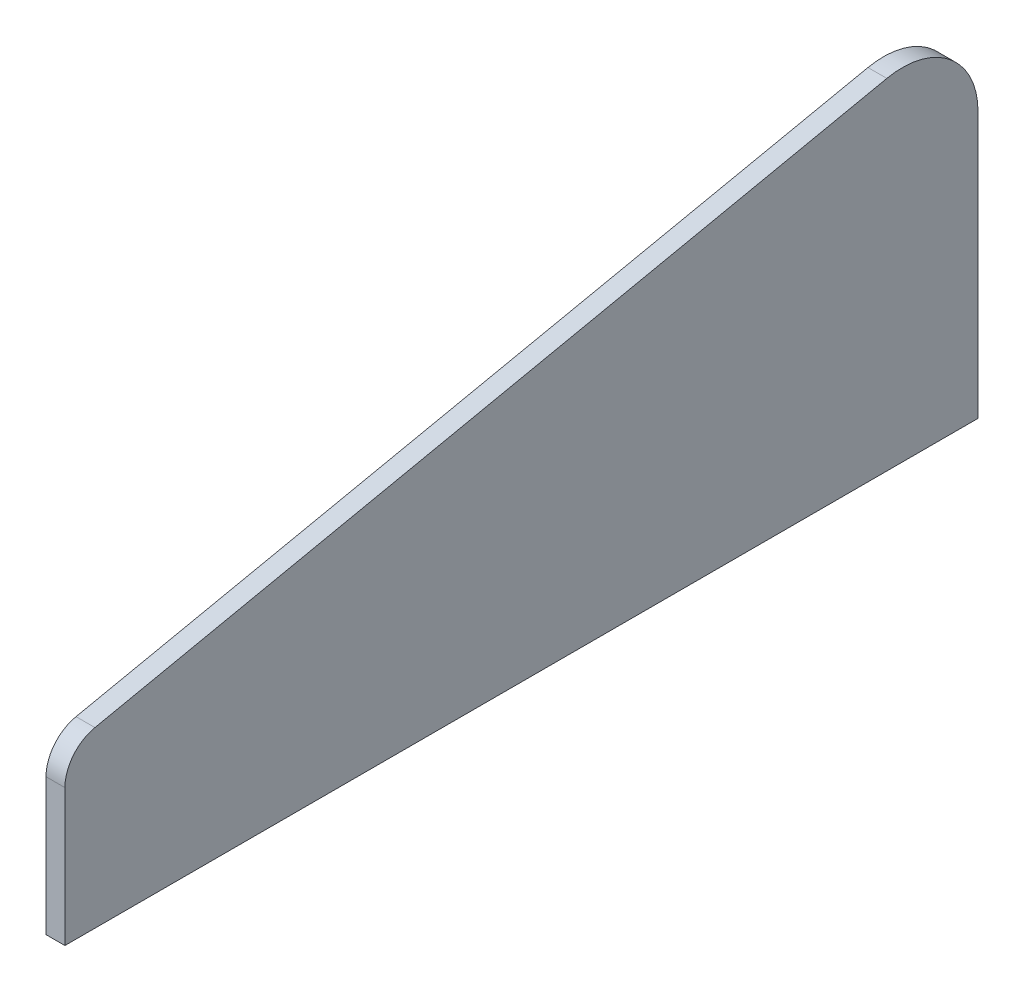
ISO-10303-21;
HEADER;
FILE_DESCRIPTION(('STEP AP214'),'2;1');
FILE_NAME('part.step','',(''),(''),'','','');
FILE_SCHEMA(('AUTOMOTIVE_DESIGN { 1 0 10303 214 1 1 1 1 }'));
ENDSEC;
DATA;
#1=APPLICATION_CONTEXT('core data for automotive mechanical design processes');
#2=APPLICATION_PROTOCOL_DEFINITION('international standard','automotive_design',2000,#1);
#3=PRODUCT_CONTEXT('',#1,'mechanical');
#4=PRODUCT('Part','Part','',(#3));
#5=PRODUCT_RELATED_PRODUCT_CATEGORY('part','',(#4));
#6=PRODUCT_DEFINITION_FORMATION('','',#4);
#7=PRODUCT_DEFINITION_CONTEXT('part definition',#1,'design');
#8=PRODUCT_DEFINITION('design','',#6,#7);
#9=PRODUCT_DEFINITION_SHAPE('','',#8);
#10=(LENGTH_UNIT() NAMED_UNIT(*) SI_UNIT(.MILLI.,.METRE.));
#11=(NAMED_UNIT(*) PLANE_ANGLE_UNIT() SI_UNIT($,.RADIAN.));
#12=(NAMED_UNIT(*) SI_UNIT($,.STERADIAN.) SOLID_ANGLE_UNIT());
#13=UNCERTAINTY_MEASURE_WITH_UNIT(LENGTH_MEASURE(1.E-05),#10,'distance_accuracy_value','');
#14=(GEOMETRIC_REPRESENTATION_CONTEXT(3) GLOBAL_UNCERTAINTY_ASSIGNED_CONTEXT((#13)) GLOBAL_UNIT_ASSIGNED_CONTEXT((#10,
#11,#12)) REPRESENTATION_CONTEXT('',''));
#15=CARTESIAN_POINT('',(0.,0.,0.));
#16=DIRECTION('',(0.,0.,1.));
#17=DIRECTION('',(1.,0.,0.));
#18=AXIS2_PLACEMENT_3D('',#15,#16,#17);
#19=CARTESIAN_POINT('',(12.7,131.198589616176,61.277709778665));
#20=DIRECTION('',(0.,0.,-1.));
#21=DIRECTION('',(0.,1.,0.));
#22=AXIS2_PLACEMENT_3D('',#19,#20,#21);
#23=PLANE('',#22);
#24=DIRECTION('',(0.,-1.,0.));
#25=VECTOR('',#24,1.);
#26=CARTESIAN_POINT('',(12.7,131.198589616176,61.277709778665));
#27=LINE('',#26,#25);
#28=CARTESIAN_POINT('',(12.7,110.576663996248,61.277709778665));
#29=VERTEX_POINT('',#28);
#30=CARTESIAN_POINT('',(12.7,18.6733487577536,61.277709778665));
#31=VERTEX_POINT('',#30);
#32=EDGE_CURVE('E207',#29,#31,#27,.T.);
#33=ORIENTED_EDGE('',*,*,#32,.F.);
#34=DIRECTION('',(-1.,0.,0.));
#35=VECTOR('',#34,1.);
#36=CARTESIAN_POINT('',(0.,110.576663996248,61.277709778665));
#37=LINE('',#36,#35);
#38=CARTESIAN_POINT('',(0.,110.576663996248,61.277709778665));
#39=VERTEX_POINT('',#38);
#40=EDGE_CURVE('E240',#29,#39,#37,.T.);
#41=ORIENTED_EDGE('',*,*,#40,.T.);
#42=DIRECTION('',(0.,-1.,0.));
#43=VECTOR('',#42,1.);
#44=CARTESIAN_POINT('',(0.,131.198589616176,61.277709778665));
#45=LINE('',#44,#43);
#46=CARTESIAN_POINT('',(0.,18.6733487577536,61.277709778665));
#47=VERTEX_POINT('',#46);
#48=EDGE_CURVE('E201',#39,#47,#45,.T.);
#49=ORIENTED_EDGE('',*,*,#48,.T.);
#50=DIRECTION('',(-1.,0.,0.));
#51=VECTOR('',#50,1.);
#52=CARTESIAN_POINT('',(12.7,18.6733487577536,61.277709778665));
#53=LINE('',#52,#51);
#54=EDGE_CURVE('E227',#31,#47,#53,.T.);
#55=ORIENTED_EDGE('',*,*,#54,.F.);
#56=EDGE_LOOP('',(#33,#41,#49,#55));
#57=FACE_BOUND('',#56,.T.);
#58=ADVANCED_FACE('F38',(#57),#23,.F.);
#59=CARTESIAN_POINT('',(12.7,18.6733487577536,-44.2101632481027));
#60=DIRECTION('',(0.,1.,0.));
#61=DIRECTION('',(0.,0.,1.));
#62=AXIS2_PLACEMENT_3D('',#59,#60,#61);
#63=PLANE('',#62);
#64=DIRECTION('',(0.,0.,-1.));
#65=VECTOR('',#64,1.);
#66=CARTESIAN_POINT('',(0.,18.6733487577536,-44.2101632481027));
#67=LINE('',#66,#65);
#68=CARTESIAN_POINT('',(0.,18.6733487577536,-552.210163248103));
#69=VERTEX_POINT('',#68);
#70=EDGE_CURVE('E219',#47,#69,#67,.T.);
#71=ORIENTED_EDGE('',*,*,#70,.T.);
#72=DIRECTION('',(-1.,0.,0.));
#73=VECTOR('',#72,1.);
#74=CARTESIAN_POINT('',(12.7,18.6733487577536,-552.210163248103));
#75=LINE('',#74,#73);
#76=CARTESIAN_POINT('',(12.7,18.6733487577536,-552.210163248103));
#77=VERTEX_POINT('',#76);
#78=EDGE_CURVE('E217',#77,#69,#75,.T.);
#79=ORIENTED_EDGE('',*,*,#78,.F.);
#80=DIRECTION('',(0.,0.,-1.));
#81=VECTOR('',#80,1.);
#82=CARTESIAN_POINT('',(12.7,18.6733487577536,61.277709778665));
#83=LINE('',#82,#81);
#84=EDGE_CURVE('E209',#31,#77,#83,.T.);
#85=ORIENTED_EDGE('',*,*,#84,.F.);
#86=ORIENTED_EDGE('',*,*,#54,.T.);
#87=EDGE_LOOP('',(#71,#79,#85,#86));
#88=FACE_BOUND('',#87,.T.);
#89=ADVANCED_FACE('F267',(#88),#63,.F.);
#90=CARTESIAN_POINT('',(12.7,18.6733487577536,-552.210163248103));
#91=DIRECTION('',(0.,0.,1.));
#92=DIRECTION('',(1.,0.,0.));
#93=AXIS2_PLACEMENT_3D('',#90,#91,#92);
#94=PLANE('',#93);
#95=DIRECTION('',(0.,1.,0.));
#96=VECTOR('',#95,1.);
#97=CARTESIAN_POINT('',(0.,18.6733487577536,-552.210163248103));
#98=LINE('',#97,#96);
#99=CARTESIAN_POINT('',(0.,197.403052279081,-552.210163248103));
#100=VERTEX_POINT('',#99);
#101=EDGE_CURVE('E221',#69,#100,#98,.T.);
#102=ORIENTED_EDGE('',*,*,#101,.T.);
#103=DIRECTION('',(-1.,0.,0.));
#104=VECTOR('',#103,1.);
#105=CARTESIAN_POINT('',(12.7,197.403052279081,-552.210163248103));
#106=LINE('',#105,#104);
#107=CARTESIAN_POINT('',(12.7,197.403052279081,-552.210163248103));
#108=VERTEX_POINT('',#107);
#109=EDGE_CURVE('E235',#100,#108,#106,.F.);
#110=ORIENTED_EDGE('',*,*,#109,.T.);
#111=DIRECTION('',(0.,1.,0.));
#112=VECTOR('',#111,1.);
#113=CARTESIAN_POINT('',(12.7,18.6733487577536,-552.210163248103));
#114=LINE('',#113,#112);
#115=EDGE_CURVE('E212',#77,#108,#114,.T.);
#116=ORIENTED_EDGE('',*,*,#115,.F.);
#117=ORIENTED_EDGE('',*,*,#78,.T.);
#118=EDGE_LOOP('',(#102,#110,#116,#117));
#119=FACE_BOUND('',#118,.T.);
#120=ADVANCED_FACE('F274',(#119),#94,.F.);
#121=CARTESIAN_POINT('',(12.7,131.198589616176,61.277709778665));
#122=DIRECTION('',(0.,0.978672004084347,0.205429083679814));
#123=DIRECTION('',(0.,-0.205429083679814,0.978672004084347));
#124=AXIS2_PLACEMENT_3D('',#121,#122,#123);
#125=PLANE('',#124);
#126=DIRECTION('',(0.,0.205429083679814,-0.978672004084347));
#127=VECTOR('',#126,1.);
#128=CARTESIAN_POINT('',(0.,131.198589616176,61.277709778665));
#129=LINE('',#128,#127);
#130=CARTESIAN_POINT('',(0.,135.434932899991,41.0956085041323));
#131=VERTEX_POINT('',#130);
#132=CARTESIAN_POINT('',(0.,247.119590086566,-490.974365797168));
#133=VERTEX_POINT('',#132);
#134=EDGE_CURVE('E210',#131,#133,#129,.T.);
#135=ORIENTED_EDGE('',*,*,#134,.F.);
#136=DIRECTION('',(-1.,0.,0.));
#137=VECTOR('',#136,1.);
#138=CARTESIAN_POINT('',(12.7,135.434932899991,41.0956085041323));
#139=LINE('',#138,#137);
#140=CARTESIAN_POINT('',(12.7,135.434932899991,41.0956085041323));
#141=VERTEX_POINT('',#140);
#142=EDGE_CURVE('E46',#131,#141,#139,.F.);
#143=ORIENTED_EDGE('',*,*,#142,.T.);
#144=DIRECTION('',(0.,0.205429083679814,-0.978672004084347));
#145=VECTOR('',#144,1.);
#146=CARTESIAN_POINT('',(12.7,131.198589616176,61.277709778665));
#147=LINE('',#146,#145);
#148=CARTESIAN_POINT('',(12.7,247.119590086566,-490.974365797168));
#149=VERTEX_POINT('',#148);
#150=EDGE_CURVE('E215',#141,#149,#147,.T.);
#151=ORIENTED_EDGE('',*,*,#150,.T.);
#152=DIRECTION('',(-1.,0.,0.));
#153=VECTOR('',#152,1.);
#154=CARTESIAN_POINT('',(0.,247.119590086566,-490.974365797168));
#155=LINE('',#154,#153);
#156=EDGE_CURVE('E230',#149,#133,#155,.T.);
#157=ORIENTED_EDGE('',*,*,#156,.T.);
#158=EDGE_LOOP('',(#135,#143,#151,#157));
#159=FACE_BOUND('',#158,.T.);
#160=ADVANCED_FACE('F248',(#159),#125,.T.);
#161=CARTESIAN_POINT('',(12.7,0.,0.));
#162=DIRECTION('',(1.,0.,0.));
#163=DIRECTION('',(0.,0.,-1.));
#164=AXIS2_PLACEMENT_3D('',#161,#162,#163);
#165=PLANE('',#164);
#166=ORIENTED_EDGE('',*,*,#150,.F.);
#167=CARTESIAN_POINT('',(12.7,110.576663996248,35.877709778665));
#168=DIRECTION('',(1.,0.,0.));
#169=DIRECTION('',(0.,0.,-1.));
#170=AXIS2_PLACEMENT_3D('',#167,#168,#169);
#171=CIRCLE('',#170,25.4);
#172=EDGE_CURVE('E11',#141,#29,#171,.T.);
#173=ORIENTED_EDGE('',*,*,#172,.T.);
#174=ORIENTED_EDGE('',*,*,#32,.T.);
#175=ORIENTED_EDGE('',*,*,#84,.T.);
#176=ORIENTED_EDGE('',*,*,#115,.T.);
#177=CARTESIAN_POINT('',(12.7,197.403052279081,-501.410163248103));
#178=DIRECTION('',(1.,0.,0.));
#179=DIRECTION('',(0.,0.,-1.));
#180=AXIS2_PLACEMENT_3D('',#177,#178,#179);
#181=CIRCLE('',#180,50.8);
#182=EDGE_CURVE('E237',#108,#149,#181,.T.);
#183=ORIENTED_EDGE('',*,*,#182,.T.);
#184=EDGE_LOOP('',(#166,#173,#174,#175,#176,#183));
#185=FACE_BOUND('',#184,.T.);
#186=ADVANCED_FACE('F252',(#185),#165,.T.);
#187=CARTESIAN_POINT('',(0.,0.,0.));
#188=DIRECTION('',(1.,0.,0.));
#189=DIRECTION('',(0.,0.,-1.));
#190=AXIS2_PLACEMENT_3D('',#187,#188,#189);
#191=PLANE('',#190);
#192=DIRECTION('',(0.,0.104528463267653,-0.994521895368273));
#193=VECTOR('',#192,1.);
#194=CARTESIAN_POINT('',(0.,116.103340809266,-335.010155346367));
#195=LINE('',#194,#193);
#196=CARTESIAN_POINT('',(0.,114.012771543912,-315.119717439002));
#197=VERTEX_POINT('',#196);
#198=CARTESIAN_POINT('',(0.,116.103340809266,-335.010155346367));
#199=VERTEX_POINT('',#198);
#200=EDGE_CURVE('E167',#197,#199,#195,.T.);
#201=ORIENTED_EDGE('',*,*,#200,.F.);
#202=DIRECTION('',(0.,0.994521895368274,0.10452846326765));
#203=VECTOR('',#202,1.);
#204=CARTESIAN_POINT('',(0.,109.040162067071,-315.64235975534));
#205=LINE('',#204,#203);
#206=CARTESIAN_POINT('',(0.,109.040162067071,-315.64235975534));
#207=VERTEX_POINT('',#206);
#208=EDGE_CURVE('E53',#207,#197,#205,.T.);
#209=ORIENTED_EDGE('',*,*,#208,.F.);
#210=DIRECTION('',(0.,-0.104528463267654,0.994521895368273));
#211=VECTOR('',#210,1.);
#212=CARTESIAN_POINT('',(0.,111.130731332424,-335.532797662705));
#213=LINE('',#212,#211);
#214=CARTESIAN_POINT('',(0.,111.130731332424,-335.532797662705));
#215=VERTEX_POINT('',#214);
#216=EDGE_CURVE('E158',#215,#207,#213,.T.);
#217=ORIENTED_EDGE('',*,*,#216,.F.);
#218=DIRECTION('',(0.,-0.994521895368274,-0.10452846326765));
#219=VECTOR('',#218,1.);
#220=CARTESIAN_POINT('',(0.,111.130731332424,-335.532797662705));
#221=LINE('',#220,#219);
#222=EDGE_CURVE('E161',#199,#215,#221,.T.);
#223=ORIENTED_EDGE('',*,*,#222,.F.);
#224=EDGE_LOOP('',(#201,#209,#217,#223));
#225=FACE_BOUND('',#224,.T.);
#226=DIRECTION('',(0.,0.0523359562429437,-0.998629534754574));
#227=VECTOR('',#226,1.);
#228=CARTESIAN_POINT('',(0.,73.6297125380584,-130.527038464193));
#229=LINE('',#228,#227);
#230=CARTESIAN_POINT('',(0.,72.5829934131996,-110.554447769102));
#231=VERTEX_POINT('',#230);
#232=CARTESIAN_POINT('',(0.,73.6297125380584,-130.527038464193));
#233=VERTEX_POINT('',#232);
#234=EDGE_CURVE('E191',#231,#233,#229,.T.);
#235=ORIENTED_EDGE('',*,*,#234,.F.);
#236=DIRECTION('',(0.,0.998629534754574,0.0523359562429437));
#237=VECTOR('',#236,1.);
#238=CARTESIAN_POINT('',(0.,67.5898457394267,-110.816127550316));
#239=LINE('',#238,#237);
#240=CARTESIAN_POINT('',(0.,67.5898457394267,-110.816127550316));
#241=VERTEX_POINT('',#240);
#242=EDGE_CURVE('E61',#241,#231,#239,.T.);
#243=ORIENTED_EDGE('',*,*,#242,.F.);
#244=DIRECTION('',(0.,-0.0523359562429437,0.998629534754574));
#245=VECTOR('',#244,1.);
#246=CARTESIAN_POINT('',(0.,68.6365648642856,-130.788718245408));
#247=LINE('',#246,#245);
#248=CARTESIAN_POINT('',(0.,68.6365648642856,-130.788718245408));
#249=VERTEX_POINT('',#248);
#250=EDGE_CURVE('E180',#249,#241,#247,.T.);
#251=ORIENTED_EDGE('',*,*,#250,.F.);
#252=DIRECTION('',(0.,-0.998629534754574,-0.0523359562429437));
#253=VECTOR('',#252,1.);
#254=CARTESIAN_POINT('',(0.,68.6365648642856,-130.788718245408));
#255=LINE('',#254,#253);
#256=EDGE_CURVE('E194',#233,#249,#255,.T.);
#257=ORIENTED_EDGE('',*,*,#256,.F.);
#258=EDGE_LOOP('',(#235,#243,#251,#257));
#259=FACE_BOUND('',#258,.T.);
#260=ORIENTED_EDGE('',*,*,#48,.F.);
#261=CARTESIAN_POINT('',(0.,110.576663996248,35.877709778665));
#262=DIRECTION('',(1.,0.,0.));
#263=DIRECTION('',(0.,0.,-1.));
#264=AXIS2_PLACEMENT_3D('',#261,#262,#263);
#265=CIRCLE('',#264,25.4);
#266=EDGE_CURVE('E243',#39,#131,#265,.F.);
#267=ORIENTED_EDGE('',*,*,#266,.T.);
#268=ORIENTED_EDGE('',*,*,#134,.T.);
#269=CARTESIAN_POINT('',(0.,197.403052279081,-501.410163248103));
#270=DIRECTION('',(1.,0.,0.));
#271=DIRECTION('',(0.,0.,-1.));
#272=AXIS2_PLACEMENT_3D('',#269,#270,#271);
#273=CIRCLE('',#272,50.8);
#274=EDGE_CURVE('E233',#133,#100,#273,.F.);
#275=ORIENTED_EDGE('',*,*,#274,.T.);
#276=ORIENTED_EDGE('',*,*,#101,.F.);
#277=ORIENTED_EDGE('',*,*,#70,.F.);
#278=EDGE_LOOP('',(#260,#267,#268,#275,#276,#277));
#279=FACE_BOUND('',#278,.T.);
#280=ADVANCED_FACE('F262',(#225,#259,#279),#191,.F.);
#281=CARTESIAN_POINT('',(12.7,197.403052279081,-501.410163248103));
#282=DIRECTION('',(1.,0.,0.));
#283=DIRECTION('',(0.,0.,-1.));
#284=AXIS2_PLACEMENT_3D('',#281,#282,#283);
#285=CYLINDRICAL_SURFACE('',#284,50.8);
#286=ORIENTED_EDGE('',*,*,#182,.F.);
#287=ORIENTED_EDGE('',*,*,#109,.F.);
#288=ORIENTED_EDGE('',*,*,#274,.F.);
#289=ORIENTED_EDGE('',*,*,#156,.F.);
#290=EDGE_LOOP('',(#286,#287,#288,#289));
#291=FACE_BOUND('',#290,.T.);
#292=ADVANCED_FACE('F272',(#291),#285,.T.);
#293=CARTESIAN_POINT('',(12.7,110.576663996248,35.877709778665));
#294=DIRECTION('',(1.,0.,0.));
#295=DIRECTION('',(0.,0.,-1.));
#296=AXIS2_PLACEMENT_3D('',#293,#294,#295);
#297=CYLINDRICAL_SURFACE('',#296,25.4);
#298=ORIENTED_EDGE('',*,*,#172,.F.);
#299=ORIENTED_EDGE('',*,*,#142,.F.);
#300=ORIENTED_EDGE('',*,*,#266,.F.);
#301=ORIENTED_EDGE('',*,*,#40,.F.);
#302=EDGE_LOOP('',(#298,#299,#300,#301));
#303=FACE_BOUND('',#302,.T.);
#304=ADVANCED_FACE('F40',(#303),#297,.T.);
#305=CARTESIAN_POINT('',(5.,67.5898457394267,-110.816127550316));
#306=DIRECTION('',(0.,-0.0523359562429437,0.998629534754574));
#307=DIRECTION('',(0.,-0.998629534754574,-0.0523359562429437));
#308=AXIS2_PLACEMENT_3D('',#305,#306,#307);
#309=PLANE('',#308);
#310=ORIENTED_EDGE('',*,*,#242,.T.);
#311=DIRECTION('',(-1.,0.,0.));
#312=VECTOR('',#311,1.);
#313=CARTESIAN_POINT('',(5.,72.5829934131996,-110.554447769102));
#314=LINE('',#313,#312);
#315=CARTESIAN_POINT('',(5.,72.5829934131996,-110.554447769102));
#316=VERTEX_POINT('',#315);
#317=EDGE_CURVE('E189',#316,#231,#314,.T.);
#318=ORIENTED_EDGE('',*,*,#317,.F.);
#319=DIRECTION('',(0.,0.998629534754574,0.0523359562429437));
#320=VECTOR('',#319,1.);
#321=CARTESIAN_POINT('',(5.,67.5898457394267,-110.816127550316));
#322=LINE('',#321,#320);
#323=CARTESIAN_POINT('',(5.,67.5898457394267,-110.816127550316));
#324=VERTEX_POINT('',#323);
#325=EDGE_CURVE('E176',#324,#316,#322,.T.);
#326=ORIENTED_EDGE('',*,*,#325,.F.);
#327=DIRECTION('',(-1.,0.,0.));
#328=VECTOR('',#327,1.);
#329=CARTESIAN_POINT('',(5.,67.5898457394267,-110.816127550316));
#330=LINE('',#329,#328);
#331=EDGE_CURVE('E199',#324,#241,#330,.T.);
#332=ORIENTED_EDGE('',*,*,#331,.T.);
#333=EDGE_LOOP('',(#310,#318,#326,#332));
#334=FACE_BOUND('',#333,.T.);
#335=ADVANCED_FACE('F292',(#334),#309,.F.);
#336=CARTESIAN_POINT('',(5.,68.6365648642856,-130.788718245408));
#337=DIRECTION('',(0.,-0.998629534754574,-0.0523359562429437));
#338=DIRECTION('',(0.,0.0523359562429437,-0.998629534754574));
#339=AXIS2_PLACEMENT_3D('',#336,#337,#338);
#340=PLANE('',#339);
#341=ORIENTED_EDGE('',*,*,#250,.T.);
#342=ORIENTED_EDGE('',*,*,#331,.F.);
#343=DIRECTION('',(0.,-0.0523359562429437,0.998629534754574));
#344=VECTOR('',#343,1.);
#345=CARTESIAN_POINT('',(5.,68.6365648642856,-130.788718245408));
#346=LINE('',#345,#344);
#347=CARTESIAN_POINT('',(5.,68.6365648642856,-130.788718245408));
#348=VERTEX_POINT('',#347);
#349=EDGE_CURVE('E186',#348,#324,#346,.T.);
#350=ORIENTED_EDGE('',*,*,#349,.F.);
#351=DIRECTION('',(-1.,0.,0.));
#352=VECTOR('',#351,1.);
#353=CARTESIAN_POINT('',(5.,68.6365648642856,-130.788718245408));
#354=LINE('',#353,#352);
#355=EDGE_CURVE('E202',#348,#249,#354,.T.);
#356=ORIENTED_EDGE('',*,*,#355,.T.);
#357=EDGE_LOOP('',(#341,#342,#350,#356));
#358=FACE_BOUND('',#357,.T.);
#359=ADVANCED_FACE('F303',(#358),#340,.F.);
#360=CARTESIAN_POINT('',(5.,68.6365648642856,-130.788718245408));
#361=DIRECTION('',(0.,0.0523359562429437,-0.998629534754574));
#362=DIRECTION('',(0.,0.998629534754574,0.0523359562429437));
#363=AXIS2_PLACEMENT_3D('',#360,#361,#362);
#364=PLANE('',#363);
#365=ORIENTED_EDGE('',*,*,#256,.T.);
#366=ORIENTED_EDGE('',*,*,#355,.F.);
#367=DIRECTION('',(0.,-0.998629534754574,-0.0523359562429437));
#368=VECTOR('',#367,1.);
#369=CARTESIAN_POINT('',(5.,68.6365648642856,-130.788718245408));
#370=LINE('',#369,#368);
#371=CARTESIAN_POINT('',(5.,73.6297125380584,-130.527038464193));
#372=VERTEX_POINT('',#371);
#373=EDGE_CURVE('E183',#372,#348,#370,.T.);
#374=ORIENTED_EDGE('',*,*,#373,.F.);
#375=DIRECTION('',(-1.,0.,0.));
#376=VECTOR('',#375,1.);
#377=CARTESIAN_POINT('',(5.,73.6297125380584,-130.527038464193));
#378=LINE('',#377,#376);
#379=EDGE_CURVE('E204',#372,#233,#378,.T.);
#380=ORIENTED_EDGE('',*,*,#379,.T.);
#381=EDGE_LOOP('',(#365,#366,#374,#380));
#382=FACE_BOUND('',#381,.T.);
#383=ADVANCED_FACE('F308',(#382),#364,.F.);
#384=CARTESIAN_POINT('',(5.,73.6297125380584,-130.527038464193));
#385=DIRECTION('',(0.,0.998629534754574,0.0523359562429437));
#386=DIRECTION('',(0.,-0.0523359562429437,0.998629534754574));
#387=AXIS2_PLACEMENT_3D('',#384,#385,#386);
#388=PLANE('',#387);
#389=ORIENTED_EDGE('',*,*,#234,.T.);
#390=ORIENTED_EDGE('',*,*,#379,.F.);
#391=DIRECTION('',(0.,0.0523359562429437,-0.998629534754574));
#392=VECTOR('',#391,1.);
#393=CARTESIAN_POINT('',(5.,73.6297125380584,-130.527038464193));
#394=LINE('',#393,#392);
#395=EDGE_CURVE('E179',#316,#372,#394,.T.);
#396=ORIENTED_EDGE('',*,*,#395,.F.);
#397=ORIENTED_EDGE('',*,*,#317,.T.);
#398=EDGE_LOOP('',(#389,#390,#396,#397));
#399=FACE_BOUND('',#398,.T.);
#400=ADVANCED_FACE('F304',(#399),#388,.F.);
#401=CARTESIAN_POINT('',(5.,0.,0.));
#402=DIRECTION('',(1.,0.,0.));
#403=DIRECTION('',(0.,0.,-1.));
#404=AXIS2_PLACEMENT_3D('',#401,#402,#403);
#405=PLANE('',#404);
#406=ORIENTED_EDGE('',*,*,#325,.T.);
#407=ORIENTED_EDGE('',*,*,#395,.T.);
#408=ORIENTED_EDGE('',*,*,#373,.T.);
#409=ORIENTED_EDGE('',*,*,#349,.T.);
#410=EDGE_LOOP('',(#406,#407,#408,#409));
#411=FACE_BOUND('',#410,.T.);
#412=ADVANCED_FACE('F307',(#411),#405,.F.);
#413=CARTESIAN_POINT('',(5.,109.040162067071,-315.64235975534));
#414=DIRECTION('',(0.,-0.10452846326765,0.994521895368274));
#415=DIRECTION('',(0.,-0.994521895368274,-0.10452846326765));
#416=AXIS2_PLACEMENT_3D('',#413,#414,#415);
#417=PLANE('',#416);
#418=ORIENTED_EDGE('',*,*,#208,.T.);
#419=DIRECTION('',(-1.,0.,0.));
#420=VECTOR('',#419,1.);
#421=CARTESIAN_POINT('',(5.,114.012771543912,-315.119717439002));
#422=LINE('',#421,#420);
#423=CARTESIAN_POINT('',(5.,114.012771543912,-315.119717439002));
#424=VERTEX_POINT('',#423);
#425=EDGE_CURVE('E136',#424,#197,#422,.T.);
#426=ORIENTED_EDGE('',*,*,#425,.F.);
#427=DIRECTION('',(0.,0.994521895368274,0.10452846326765));
#428=VECTOR('',#427,1.);
#429=CARTESIAN_POINT('',(5.,109.040162067071,-315.64235975534));
#430=LINE('',#429,#428);
#431=CARTESIAN_POINT('',(5.,109.040162067071,-315.64235975534));
#432=VERTEX_POINT('',#431);
#433=EDGE_CURVE('E140',#432,#424,#430,.T.);
#434=ORIENTED_EDGE('',*,*,#433,.F.);
#435=DIRECTION('',(-1.,0.,0.));
#436=VECTOR('',#435,1.);
#437=CARTESIAN_POINT('',(5.,109.040162067071,-315.64235975534));
#438=LINE('',#437,#436);
#439=EDGE_CURVE('E171',#432,#207,#438,.T.);
#440=ORIENTED_EDGE('',*,*,#439,.T.);
#441=EDGE_LOOP('',(#418,#426,#434,#440));
#442=FACE_BOUND('',#441,.T.);
#443=ADVANCED_FACE('F138',(#442),#417,.F.);
#444=CARTESIAN_POINT('',(5.,111.130731332424,-335.532797662705));
#445=DIRECTION('',(0.,-0.994521895368273,-0.104528463267654));
#446=DIRECTION('',(0.,0.104528463267654,-0.994521895368273));
#447=AXIS2_PLACEMENT_3D('',#444,#445,#446);
#448=PLANE('',#447);
#449=ORIENTED_EDGE('',*,*,#216,.T.);
#450=ORIENTED_EDGE('',*,*,#439,.F.);
#451=DIRECTION('',(0.,-0.104528463267654,0.994521895368273));
#452=VECTOR('',#451,1.);
#453=CARTESIAN_POINT('',(5.,111.130731332424,-335.532797662705));
#454=LINE('',#453,#452);
#455=CARTESIAN_POINT('',(5.,111.130731332424,-335.532797662705));
#456=VERTEX_POINT('',#455);
#457=EDGE_CURVE('E146',#456,#432,#454,.T.);
#458=ORIENTED_EDGE('',*,*,#457,.F.);
#459=DIRECTION('',(-1.,0.,0.));
#460=VECTOR('',#459,1.);
#461=CARTESIAN_POINT('',(5.,111.130731332424,-335.532797662705));
#462=LINE('',#461,#460);
#463=EDGE_CURVE('E173',#456,#215,#462,.T.);
#464=ORIENTED_EDGE('',*,*,#463,.T.);
#465=EDGE_LOOP('',(#449,#450,#458,#464));
#466=FACE_BOUND('',#465,.T.);
#467=ADVANCED_FACE('F321',(#466),#448,.F.);
#468=CARTESIAN_POINT('',(5.,111.130731332424,-335.532797662705));
#469=DIRECTION('',(0.,0.10452846326765,-0.994521895368274));
#470=DIRECTION('',(0.,0.994521895368274,0.10452846326765));
#471=AXIS2_PLACEMENT_3D('',#468,#469,#470);
#472=PLANE('',#471);
#473=ORIENTED_EDGE('',*,*,#222,.T.);
#474=ORIENTED_EDGE('',*,*,#463,.F.);
#475=DIRECTION('',(0.,-0.994521895368274,-0.10452846326765));
#476=VECTOR('',#475,1.);
#477=CARTESIAN_POINT('',(5.,111.130731332424,-335.532797662705));
#478=LINE('',#477,#476);
#479=CARTESIAN_POINT('',(5.,116.103340809266,-335.010155346367));
#480=VERTEX_POINT('',#479);
#481=EDGE_CURVE('E154',#480,#456,#478,.T.);
#482=ORIENTED_EDGE('',*,*,#481,.F.);
#483=DIRECTION('',(-1.,0.,0.));
#484=VECTOR('',#483,1.);
#485=CARTESIAN_POINT('',(5.,116.103340809266,-335.010155346367));
#486=LINE('',#485,#484);
#487=EDGE_CURVE('E145',#480,#199,#486,.T.);
#488=ORIENTED_EDGE('',*,*,#487,.T.);
#489=EDGE_LOOP('',(#473,#474,#482,#488));
#490=FACE_BOUND('',#489,.T.);
#491=ADVANCED_FACE('F324',(#490),#472,.F.);
#492=CARTESIAN_POINT('',(5.,116.103340809266,-335.010155346367));
#493=DIRECTION('',(0.,0.994521895368273,0.104528463267653));
#494=DIRECTION('',(0.,-0.104528463267653,0.994521895368273));
#495=AXIS2_PLACEMENT_3D('',#492,#493,#494);
#496=PLANE('',#495);
#497=ORIENTED_EDGE('',*,*,#200,.T.);
#498=ORIENTED_EDGE('',*,*,#487,.F.);
#499=DIRECTION('',(0.,0.104528463267653,-0.994521895368273));
#500=VECTOR('',#499,1.);
#501=CARTESIAN_POINT('',(5.,116.103340809266,-335.010155346367));
#502=LINE('',#501,#500);
#503=EDGE_CURVE('E149',#424,#480,#502,.T.);
#504=ORIENTED_EDGE('',*,*,#503,.F.);
#505=ORIENTED_EDGE('',*,*,#425,.T.);
#506=EDGE_LOOP('',(#497,#498,#504,#505));
#507=FACE_BOUND('',#506,.T.);
#508=ADVANCED_FACE('F150',(#507),#496,.F.);
#509=CARTESIAN_POINT('',(5.,0.,0.));
#510=DIRECTION('',(1.,0.,0.));
#511=DIRECTION('',(0.,0.,-1.));
#512=AXIS2_PLACEMENT_3D('',#509,#510,#511);
#513=PLANE('',#512);
#514=ORIENTED_EDGE('',*,*,#433,.T.);
#515=ORIENTED_EDGE('',*,*,#503,.T.);
#516=ORIENTED_EDGE('',*,*,#481,.T.);
#517=ORIENTED_EDGE('',*,*,#457,.T.);
#518=EDGE_LOOP('',(#514,#515,#516,#517));
#519=FACE_BOUND('',#518,.T.);
#520=ADVANCED_FACE('F156',(#519),#513,.F.);
#521=CLOSED_SHELL('',(#58,#89,#120,#160,#186,#280,#292,#304,#335,#359,#383,#400,#412,#443,#467,
#491,#508,#520));
#522=MANIFOLD_SOLID_BREP('B2',#521);
#523=ADVANCED_BREP_SHAPE_REPRESENTATION('',(#18,#522),#14);
#524=SHAPE_DEFINITION_REPRESENTATION(#9,#523);
ENDSEC;
END-ISO-10303-21;
